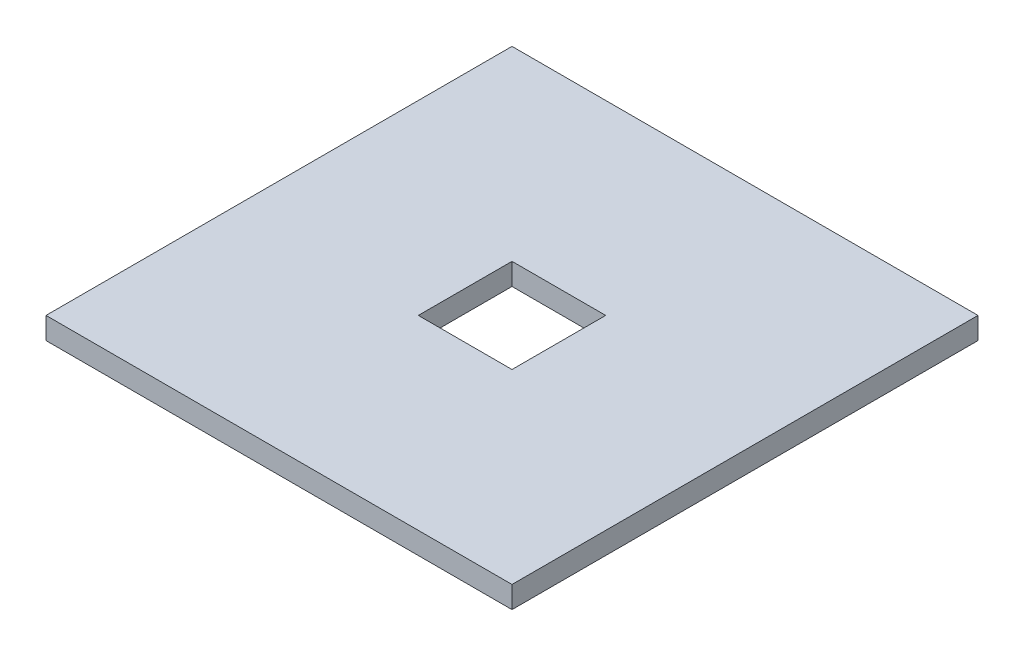
ISO-10303-21;
HEADER;
FILE_DESCRIPTION(('STEP AP214'),'2;1');
FILE_NAME('part.step','',(''),(''),'','','');
FILE_SCHEMA(('AUTOMOTIVE_DESIGN { 1 0 10303 214 1 1 1 1 }'));
ENDSEC;
DATA;
#1=APPLICATION_CONTEXT('core data for automotive mechanical design processes');
#2=APPLICATION_PROTOCOL_DEFINITION('international standard','automotive_design',2000,#1);
#3=PRODUCT_CONTEXT('',#1,'mechanical');
#4=PRODUCT('Part','Part','',(#3));
#5=PRODUCT_RELATED_PRODUCT_CATEGORY('part','',(#4));
#6=PRODUCT_DEFINITION_FORMATION('','',#4);
#7=PRODUCT_DEFINITION_CONTEXT('part definition',#1,'design');
#8=PRODUCT_DEFINITION('design','',#6,#7);
#9=PRODUCT_DEFINITION_SHAPE('','',#8);
#10=(LENGTH_UNIT() NAMED_UNIT(*) SI_UNIT(.MILLI.,.METRE.));
#11=(NAMED_UNIT(*) PLANE_ANGLE_UNIT() SI_UNIT($,.RADIAN.));
#12=(NAMED_UNIT(*) SI_UNIT($,.STERADIAN.) SOLID_ANGLE_UNIT());
#13=UNCERTAINTY_MEASURE_WITH_UNIT(LENGTH_MEASURE(1.E-05),#10,'distance_accuracy_value','');
#14=(GEOMETRIC_REPRESENTATION_CONTEXT(3) GLOBAL_UNCERTAINTY_ASSIGNED_CONTEXT((#13)) GLOBAL_UNIT_ASSIGNED_CONTEXT((#10,
#11,#12)) REPRESENTATION_CONTEXT('',''));
#15=CARTESIAN_POINT('',(0.,0.,0.));
#16=DIRECTION('',(0.,0.,1.));
#17=DIRECTION('',(1.,0.,0.));
#18=AXIS2_PLACEMENT_3D('',#15,#16,#17);
#19=CARTESIAN_POINT('',(149.225,13.97,149.225));
#20=DIRECTION('',(-1.,0.,0.));
#21=DIRECTION('',(0.,0.,1.));
#22=AXIS2_PLACEMENT_3D('',#19,#20,#21);
#23=PLANE('',#22);
#24=DIRECTION('',(0.,0.,-1.));
#25=VECTOR('',#24,1.);
#26=CARTESIAN_POINT('',(149.225,0.,149.225));
#27=LINE('',#26,#25);
#28=CARTESIAN_POINT('',(149.225,0.,149.225));
#29=VERTEX_POINT('',#28);
#30=CARTESIAN_POINT('',(149.225,0.,-149.225));
#31=VERTEX_POINT('',#30);
#32=EDGE_CURVE('E133',#29,#31,#27,.T.);
#33=ORIENTED_EDGE('',*,*,#32,.T.);
#34=DIRECTION('',(0.,-1.,0.));
#35=VECTOR('',#34,1.);
#36=CARTESIAN_POINT('',(149.225,13.97,-149.225));
#37=LINE('',#36,#35);
#38=CARTESIAN_POINT('',(149.225,13.97,-149.225));
#39=VERTEX_POINT('',#38);
#40=EDGE_CURVE('E11',#39,#31,#37,.T.);
#41=ORIENTED_EDGE('',*,*,#40,.F.);
#42=DIRECTION('',(0.,0.,-1.));
#43=VECTOR('',#42,1.);
#44=CARTESIAN_POINT('',(149.225,13.97,149.225));
#45=LINE('',#44,#43);
#46=CARTESIAN_POINT('',(149.225,13.97,149.225));
#47=VERTEX_POINT('',#46);
#48=EDGE_CURVE('E137',#47,#39,#45,.T.);
#49=ORIENTED_EDGE('',*,*,#48,.F.);
#50=DIRECTION('',(0.,-1.,0.));
#51=VECTOR('',#50,1.);
#52=CARTESIAN_POINT('',(149.225,13.97,149.225));
#53=LINE('',#52,#51);
#54=EDGE_CURVE('E147',#47,#29,#53,.T.);
#55=ORIENTED_EDGE('',*,*,#54,.T.);
#56=EDGE_LOOP('',(#33,#41,#49,#55));
#57=FACE_BOUND('',#56,.T.);
#58=ADVANCED_FACE('F36',(#57),#23,.F.);
#59=CARTESIAN_POINT('',(-149.225,13.97,-149.225));
#60=DIRECTION('',(0.,0.,1.));
#61=DIRECTION('',(1.,0.,0.));
#62=AXIS2_PLACEMENT_3D('',#59,#60,#61);
#63=PLANE('',#62);
#64=DIRECTION('',(-1.,0.,0.));
#65=VECTOR('',#64,1.);
#66=CARTESIAN_POINT('',(-149.225,0.,-149.225));
#67=LINE('',#66,#65);
#68=CARTESIAN_POINT('',(-149.225,0.,-149.225));
#69=VERTEX_POINT('',#68);
#70=EDGE_CURVE('E150',#31,#69,#67,.T.);
#71=ORIENTED_EDGE('',*,*,#70,.T.);
#72=DIRECTION('',(0.,-1.,0.));
#73=VECTOR('',#72,1.);
#74=CARTESIAN_POINT('',(-149.225,13.97,-149.225));
#75=LINE('',#74,#73);
#76=CARTESIAN_POINT('',(-149.225,13.97,-149.225));
#77=VERTEX_POINT('',#76);
#78=EDGE_CURVE('E43',#77,#69,#75,.T.);
#79=ORIENTED_EDGE('',*,*,#78,.F.);
#80=DIRECTION('',(-1.,0.,0.));
#81=VECTOR('',#80,1.);
#82=CARTESIAN_POINT('',(-149.225,13.97,-149.225));
#83=LINE('',#82,#81);
#84=EDGE_CURVE('E140',#39,#77,#83,.T.);
#85=ORIENTED_EDGE('',*,*,#84,.F.);
#86=ORIENTED_EDGE('',*,*,#40,.T.);
#87=EDGE_LOOP('',(#71,#79,#85,#86));
#88=FACE_BOUND('',#87,.T.);
#89=ADVANCED_FACE('F178',(#88),#63,.F.);
#90=CARTESIAN_POINT('',(-149.225,13.97,149.225));
#91=DIRECTION('',(1.,0.,0.));
#92=DIRECTION('',(0.,0.,-1.));
#93=AXIS2_PLACEMENT_3D('',#90,#91,#92);
#94=PLANE('',#93);
#95=DIRECTION('',(0.,0.,1.));
#96=VECTOR('',#95,1.);
#97=CARTESIAN_POINT('',(-149.225,0.,149.225));
#98=LINE('',#97,#96);
#99=CARTESIAN_POINT('',(-149.225,0.,149.225));
#100=VERTEX_POINT('',#99);
#101=EDGE_CURVE('E152',#69,#100,#98,.T.);
#102=ORIENTED_EDGE('',*,*,#101,.T.);
#103=DIRECTION('',(0.,-1.,0.));
#104=VECTOR('',#103,1.);
#105=CARTESIAN_POINT('',(-149.225,13.97,149.225));
#106=LINE('',#105,#104);
#107=CARTESIAN_POINT('',(-149.225,13.97,149.225));
#108=VERTEX_POINT('',#107);
#109=EDGE_CURVE('E157',#108,#100,#106,.T.);
#110=ORIENTED_EDGE('',*,*,#109,.F.);
#111=DIRECTION('',(0.,0.,1.));
#112=VECTOR('',#111,1.);
#113=CARTESIAN_POINT('',(-149.225,13.97,149.225));
#114=LINE('',#113,#112);
#115=EDGE_CURVE('E143',#77,#108,#114,.T.);
#116=ORIENTED_EDGE('',*,*,#115,.F.);
#117=ORIENTED_EDGE('',*,*,#78,.T.);
#118=EDGE_LOOP('',(#102,#110,#116,#117));
#119=FACE_BOUND('',#118,.T.);
#120=ADVANCED_FACE('F164',(#119),#94,.F.);
#121=CARTESIAN_POINT('',(-149.225,13.97,149.225));
#122=DIRECTION('',(0.,0.,-1.));
#123=DIRECTION('',(-1.,0.,0.));
#124=AXIS2_PLACEMENT_3D('',#121,#122,#123);
#125=PLANE('',#124);
#126=DIRECTION('',(1.,0.,0.));
#127=VECTOR('',#126,1.);
#128=CARTESIAN_POINT('',(-149.225,0.,149.225));
#129=LINE('',#128,#127);
#130=EDGE_CURVE('E141',#100,#29,#129,.T.);
#131=ORIENTED_EDGE('',*,*,#130,.T.);
#132=ORIENTED_EDGE('',*,*,#54,.F.);
#133=DIRECTION('',(1.,0.,0.));
#134=VECTOR('',#133,1.);
#135=CARTESIAN_POINT('',(-149.225,13.97,149.225));
#136=LINE('',#135,#134);
#137=EDGE_CURVE('E145',#108,#47,#136,.T.);
#138=ORIENTED_EDGE('',*,*,#137,.F.);
#139=ORIENTED_EDGE('',*,*,#109,.T.);
#140=EDGE_LOOP('',(#131,#132,#138,#139));
#141=FACE_BOUND('',#140,.T.);
#142=ADVANCED_FACE('F171',(#141),#125,.F.);
#143=CARTESIAN_POINT('',(0.,13.97,0.));
#144=DIRECTION('',(0.,-1.,0.));
#145=DIRECTION('',(0.,0.,-1.));
#146=AXIS2_PLACEMENT_3D('',#143,#144,#145);
#147=PLANE('',#146);
#148=DIRECTION('',(-1.,0.,0.));
#149=VECTOR('',#148,1.);
#150=CARTESIAN_POINT('',(-30.,13.97,-30.));
#151=LINE('',#150,#149);
#152=CARTESIAN_POINT('',(30.,13.97,-30.));
#153=VERTEX_POINT('',#152);
#154=CARTESIAN_POINT('',(-30.,13.97,-30.));
#155=VERTEX_POINT('',#154);
#156=EDGE_CURVE('E127',#153,#155,#151,.T.);
#157=ORIENTED_EDGE('',*,*,#156,.F.);
#158=DIRECTION('',(0.,0.,-1.));
#159=VECTOR('',#158,1.);
#160=CARTESIAN_POINT('',(30.,13.97,30.));
#161=LINE('',#160,#159);
#162=CARTESIAN_POINT('',(30.,13.97,30.));
#163=VERTEX_POINT('',#162);
#164=EDGE_CURVE('E50',#163,#153,#161,.T.);
#165=ORIENTED_EDGE('',*,*,#164,.F.);
#166=DIRECTION('',(1.,0.,0.));
#167=VECTOR('',#166,1.);
#168=CARTESIAN_POINT('',(-30.,13.97,30.));
#169=LINE('',#168,#167);
#170=CARTESIAN_POINT('',(-30.,13.97,30.));
#171=VERTEX_POINT('',#170);
#172=EDGE_CURVE('E118',#171,#163,#169,.T.);
#173=ORIENTED_EDGE('',*,*,#172,.F.);
#174=DIRECTION('',(0.,0.,1.));
#175=VECTOR('',#174,1.);
#176=CARTESIAN_POINT('',(-30.,13.97,30.));
#177=LINE('',#176,#175);
#178=EDGE_CURVE('E121',#155,#171,#177,.T.);
#179=ORIENTED_EDGE('',*,*,#178,.F.);
#180=EDGE_LOOP('',(#157,#165,#173,#179));
#181=FACE_BOUND('',#180,.T.);
#182=ORIENTED_EDGE('',*,*,#48,.T.);
#183=ORIENTED_EDGE('',*,*,#84,.T.);
#184=ORIENTED_EDGE('',*,*,#115,.T.);
#185=ORIENTED_EDGE('',*,*,#137,.T.);
#186=EDGE_LOOP('',(#182,#183,#184,#185));
#187=FACE_BOUND('',#186,.T.);
#188=ADVANCED_FACE('F177',(#181,#187),#147,.F.);
#189=CARTESIAN_POINT('',(0.,0.,0.));
#190=DIRECTION('',(0.,-1.,0.));
#191=DIRECTION('',(0.,0.,-1.));
#192=AXIS2_PLACEMENT_3D('',#189,#190,#191);
#193=PLANE('',#192);
#194=DIRECTION('',(0.,0.,-1.));
#195=VECTOR('',#194,1.);
#196=CARTESIAN_POINT('',(30.,0.,30.));
#197=LINE('',#196,#195);
#198=CARTESIAN_POINT('',(30.,0.,30.));
#199=VERTEX_POINT('',#198);
#200=CARTESIAN_POINT('',(30.,0.,-30.));
#201=VERTEX_POINT('',#200);
#202=EDGE_CURVE('E102',#199,#201,#197,.T.);
#203=ORIENTED_EDGE('',*,*,#202,.T.);
#204=DIRECTION('',(-1.,0.,0.));
#205=VECTOR('',#204,1.);
#206=CARTESIAN_POINT('',(-30.,0.,-30.));
#207=LINE('',#206,#205);
#208=CARTESIAN_POINT('',(-30.,0.,-30.));
#209=VERTEX_POINT('',#208);
#210=EDGE_CURVE('E111',#201,#209,#207,.T.);
#211=ORIENTED_EDGE('',*,*,#210,.T.);
#212=DIRECTION('',(0.,0.,1.));
#213=VECTOR('',#212,1.);
#214=CARTESIAN_POINT('',(-30.,0.,30.));
#215=LINE('',#214,#213);
#216=CARTESIAN_POINT('',(-30.,0.,30.));
#217=VERTEX_POINT('',#216);
#218=EDGE_CURVE('E58',#209,#217,#215,.T.);
#219=ORIENTED_EDGE('',*,*,#218,.T.);
#220=DIRECTION('',(1.,0.,0.));
#221=VECTOR('',#220,1.);
#222=CARTESIAN_POINT('',(-30.,0.,30.));
#223=LINE('',#222,#221);
#224=EDGE_CURVE('E108',#217,#199,#223,.T.);
#225=ORIENTED_EDGE('',*,*,#224,.T.);
#226=EDGE_LOOP('',(#203,#211,#219,#225));
#227=FACE_BOUND('',#226,.T.);
#228=ORIENTED_EDGE('',*,*,#32,.F.);
#229=ORIENTED_EDGE('',*,*,#130,.F.);
#230=ORIENTED_EDGE('',*,*,#101,.F.);
#231=ORIENTED_EDGE('',*,*,#70,.F.);
#232=EDGE_LOOP('',(#228,#229,#230,#231));
#233=FACE_BOUND('',#232,.T.);
#234=ADVANCED_FACE('F115',(#227,#233),#193,.T.);
#235=CARTESIAN_POINT('',(30.,0.,30.));
#236=DIRECTION('',(1.,0.,0.));
#237=DIRECTION('',(0.,0.,-1.));
#238=AXIS2_PLACEMENT_3D('',#235,#236,#237);
#239=PLANE('',#238);
#240=ORIENTED_EDGE('',*,*,#164,.T.);
#241=DIRECTION('',(0.,1.,0.));
#242=VECTOR('',#241,1.);
#243=CARTESIAN_POINT('',(30.,0.,-30.));
#244=LINE('',#243,#242);
#245=EDGE_CURVE('E98',#201,#153,#244,.T.);
#246=ORIENTED_EDGE('',*,*,#245,.F.);
#247=ORIENTED_EDGE('',*,*,#202,.F.);
#248=DIRECTION('',(0.,1.,0.));
#249=VECTOR('',#248,1.);
#250=CARTESIAN_POINT('',(30.,0.,30.));
#251=LINE('',#250,#249);
#252=EDGE_CURVE('E131',#199,#163,#251,.T.);
#253=ORIENTED_EDGE('',*,*,#252,.T.);
#254=EDGE_LOOP('',(#240,#246,#247,#253));
#255=FACE_BOUND('',#254,.T.);
#256=ADVANCED_FACE('F100',(#255),#239,.F.);
#257=CARTESIAN_POINT('',(-30.,0.,30.));
#258=DIRECTION('',(0.,0.,1.));
#259=DIRECTION('',(1.,0.,0.));
#260=AXIS2_PLACEMENT_3D('',#257,#258,#259);
#261=PLANE('',#260);
#262=ORIENTED_EDGE('',*,*,#172,.T.);
#263=ORIENTED_EDGE('',*,*,#252,.F.);
#264=ORIENTED_EDGE('',*,*,#224,.F.);
#265=DIRECTION('',(0.,1.,0.));
#266=VECTOR('',#265,1.);
#267=CARTESIAN_POINT('',(-30.,0.,30.));
#268=LINE('',#267,#266);
#269=EDGE_CURVE('E134',#217,#171,#268,.T.);
#270=ORIENTED_EDGE('',*,*,#269,.T.);
#271=EDGE_LOOP('',(#262,#263,#264,#270));
#272=FACE_BOUND('',#271,.T.);
#273=ADVANCED_FACE('F195',(#272),#261,.F.);
#274=CARTESIAN_POINT('',(-30.,0.,30.));
#275=DIRECTION('',(-1.,0.,0.));
#276=DIRECTION('',(0.,0.,1.));
#277=AXIS2_PLACEMENT_3D('',#274,#275,#276);
#278=PLANE('',#277);
#279=ORIENTED_EDGE('',*,*,#178,.T.);
#280=ORIENTED_EDGE('',*,*,#269,.F.);
#281=ORIENTED_EDGE('',*,*,#218,.F.);
#282=DIRECTION('',(0.,1.,0.));
#283=VECTOR('',#282,1.);
#284=CARTESIAN_POINT('',(-30.,0.,-30.));
#285=LINE('',#284,#283);
#286=EDGE_CURVE('E107',#209,#155,#285,.T.);
#287=ORIENTED_EDGE('',*,*,#286,.T.);
#288=EDGE_LOOP('',(#279,#280,#281,#287));
#289=FACE_BOUND('',#288,.T.);
#290=ADVANCED_FACE('F198',(#289),#278,.F.);
#291=CARTESIAN_POINT('',(-30.,0.,-30.));
#292=DIRECTION('',(0.,0.,-1.));
#293=DIRECTION('',(-1.,0.,0.));
#294=AXIS2_PLACEMENT_3D('',#291,#292,#293);
#295=PLANE('',#294);
#296=ORIENTED_EDGE('',*,*,#156,.T.);
#297=ORIENTED_EDGE('',*,*,#286,.F.);
#298=ORIENTED_EDGE('',*,*,#210,.F.);
#299=ORIENTED_EDGE('',*,*,#245,.T.);
#300=EDGE_LOOP('',(#296,#297,#298,#299));
#301=FACE_BOUND('',#300,.T.);
#302=ADVANCED_FACE('F112',(#301),#295,.F.);
#303=CLOSED_SHELL('',(#58,#89,#120,#142,#188,#234,#256,#273,#290,#302));
#304=MANIFOLD_SOLID_BREP('B2',#303);
#305=ADVANCED_BREP_SHAPE_REPRESENTATION('',(#18,#304),#14);
#306=SHAPE_DEFINITION_REPRESENTATION(#9,#305);
ENDSEC;
END-ISO-10303-21;
